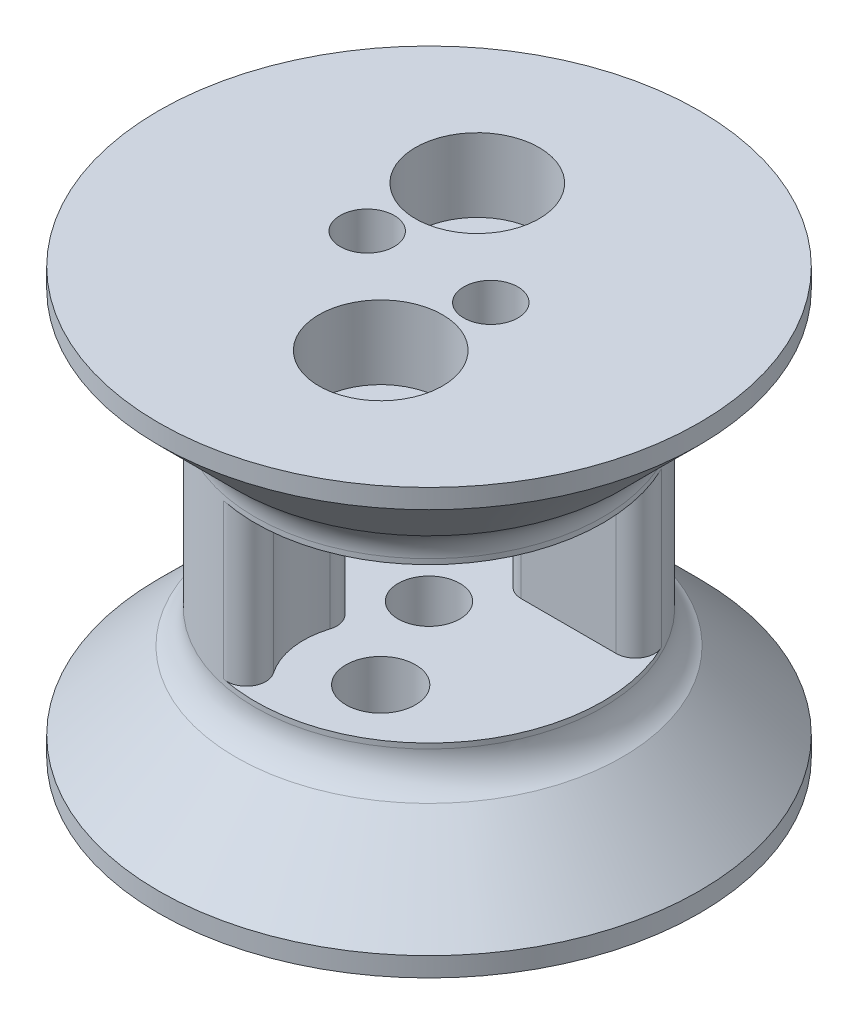
ISO-10303-21;
HEADER;
FILE_DESCRIPTION(('STEP AP214'),'2;1');
FILE_NAME('part.step','',(''),(''),'','','');
FILE_SCHEMA(('AUTOMOTIVE_DESIGN { 1 0 10303 214 1 1 1 1 }'));
ENDSEC;
DATA;
#1=APPLICATION_CONTEXT('core data for automotive mechanical design processes');
#2=APPLICATION_PROTOCOL_DEFINITION('international standard','automotive_design',2000,#1);
#3=PRODUCT_CONTEXT('',#1,'mechanical');
#4=PRODUCT('Part','Part','',(#3));
#5=PRODUCT_RELATED_PRODUCT_CATEGORY('part','',(#4));
#6=PRODUCT_DEFINITION_FORMATION('','',#4);
#7=PRODUCT_DEFINITION_CONTEXT('part definition',#1,'design');
#8=PRODUCT_DEFINITION('design','',#6,#7);
#9=PRODUCT_DEFINITION_SHAPE('','',#8);
#10=(LENGTH_UNIT() NAMED_UNIT(*) SI_UNIT(.MILLI.,.METRE.));
#11=(NAMED_UNIT(*) PLANE_ANGLE_UNIT() SI_UNIT($,.RADIAN.));
#12=(NAMED_UNIT(*) SI_UNIT($,.STERADIAN.) SOLID_ANGLE_UNIT());
#13=UNCERTAINTY_MEASURE_WITH_UNIT(LENGTH_MEASURE(1.E-05),#10,'distance_accuracy_value','');
#14=(GEOMETRIC_REPRESENTATION_CONTEXT(3) GLOBAL_UNCERTAINTY_ASSIGNED_CONTEXT((#13)) GLOBAL_UNIT_ASSIGNED_CONTEXT((#10,
#11,#12)) REPRESENTATION_CONTEXT('',''));
#15=CARTESIAN_POINT('',(0.,0.,0.));
#16=DIRECTION('',(0.,0.,1.));
#17=DIRECTION('',(1.,0.,0.));
#18=AXIS2_PLACEMENT_3D('',#15,#16,#17);
#19=CARTESIAN_POINT('',(3.17499999999952,-13.97,6.34999999999981));
#20=DIRECTION('',(0.,1.,0.));
#21=DIRECTION('',(0.,0.,1.));
#22=AXIS2_PLACEMENT_3D('',#19,#20,#21);
#23=CYLINDRICAL_SURFACE('',#22,2.286);
#24=CARTESIAN_POINT('',(3.17499999999952,5.08,6.34999999999981));
#25=DIRECTION('',(0.,1.,0.));
#26=DIRECTION('',(0.,0.,1.));
#27=AXIS2_PLACEMENT_3D('',#24,#25,#26);
#28=CIRCLE('',#27,2.286);
#29=CARTESIAN_POINT('',(3.17499999999952,5.08,8.63599999999981));
#30=VERTEX_POINT('',#29);
#31=EDGE_CURVE('E359',#30,#30,#28,.T.);
#32=ORIENTED_EDGE('',*,*,#31,.F.);
#33=EDGE_LOOP('',(#32));
#34=FACE_BOUND('',#33,.T.);
#35=CARTESIAN_POINT('',(3.17499999999952,9.144,6.34999999999981));
#36=DIRECTION('',(0.,1.,0.));
#37=DIRECTION('',(0.,0.,1.));
#38=AXIS2_PLACEMENT_3D('',#35,#36,#37);
#39=CIRCLE('',#38,2.286);
#40=CARTESIAN_POINT('',(3.17499999999952,9.144,8.63599999999981));
#41=VERTEX_POINT('',#40);
#42=EDGE_CURVE('E249',#41,#41,#39,.F.);
#43=ORIENTED_EDGE('',*,*,#42,.F.);
#44=EDGE_LOOP('',(#43));
#45=FACE_BOUND('',#44,.T.);
#46=ADVANCED_FACE('F45',(#34,#45),#23,.F.);
#47=CARTESIAN_POINT('',(-3.175,-13.97,-6.35));
#48=DIRECTION('',(0.,1.,0.));
#49=DIRECTION('',(0.,0.,1.));
#50=AXIS2_PLACEMENT_3D('',#47,#48,#49);
#51=CYLINDRICAL_SURFACE('',#50,2.286);
#52=CARTESIAN_POINT('',(-3.175,5.08,-6.35));
#53=DIRECTION('',(0.,1.,0.));
#54=DIRECTION('',(0.,0.,1.));
#55=AXIS2_PLACEMENT_3D('',#52,#53,#54);
#56=CIRCLE('',#55,2.286);
#57=CARTESIAN_POINT('',(-3.175,5.08,-4.064));
#58=VERTEX_POINT('',#57);
#59=EDGE_CURVE('E173',#58,#58,#56,.T.);
#60=ORIENTED_EDGE('',*,*,#59,.F.);
#61=EDGE_LOOP('',(#60));
#62=FACE_BOUND('',#61,.T.);
#63=CARTESIAN_POINT('',(-3.175,9.144,-6.35));
#64=DIRECTION('',(0.,1.,0.));
#65=DIRECTION('',(0.,0.,1.));
#66=AXIS2_PLACEMENT_3D('',#63,#64,#65);
#67=CIRCLE('',#66,2.286);
#68=CARTESIAN_POINT('',(-3.175,9.144,-4.064));
#69=VERTEX_POINT('',#68);
#70=EDGE_CURVE('E245',#69,#69,#67,.F.);
#71=ORIENTED_EDGE('',*,*,#70,.F.);
#72=EDGE_LOOP('',(#71));
#73=FACE_BOUND('',#72,.T.);
#74=ADVANCED_FACE('F320',(#62,#73),#51,.F.);
#75=CARTESIAN_POINT('',(0.,13.97,0.));
#76=DIRECTION('',(0.,-1.,0.));
#77=DIRECTION('',(0.,0.,-1.));
#78=AXIS2_PLACEMENT_3D('',#75,#76,#77);
#79=CYLINDRICAL_SURFACE('',#78,11.43);
#80=CARTESIAN_POINT('',(0.,5.42029547438754,0.));
#81=DIRECTION('',(0.,1.,0.));
#82=DIRECTION('',(0.,0.,1.));
#83=AXIS2_PLACEMENT_3D('',#80,#81,#82);
#84=CIRCLE('',#83,11.43);
#85=CARTESIAN_POINT('',(0.,5.42029547438754,11.43));
#86=VERTEX_POINT('',#85);
#87=EDGE_CURVE('E11',#86,#86,#84,.F.);
#88=ORIENTED_EDGE('',*,*,#87,.T.);
#89=EDGE_LOOP('',(#88));
#90=FACE_BOUND('',#89,.T.);
#91=CARTESIAN_POINT('',(0.,-5.42029547438753,0.));
#92=DIRECTION('',(0.,-1.,0.));
#93=DIRECTION('',(0.,0.,-1.));
#94=AXIS2_PLACEMENT_3D('',#91,#92,#93);
#95=CIRCLE('',#94,11.43);
#96=CARTESIAN_POINT('',(0.,-5.42029547438753,-11.43));
#97=VERTEX_POINT('',#96);
#98=EDGE_CURVE('E55',#97,#97,#95,.F.);
#99=ORIENTED_EDGE('',*,*,#98,.T.);
#100=EDGE_LOOP('',(#99));
#101=FACE_BOUND('',#100,.T.);
#102=CARTESIAN_POINT('',(0.,5.08,0.));
#103=DIRECTION('',(0.,1.,0.));
#104=DIRECTION('',(0.,0.,1.));
#105=AXIS2_PLACEMENT_3D('',#102,#103,#104);
#106=CIRCLE('',#105,11.43);
#107=CARTESIAN_POINT('',(2.31307511856047,5.08,-11.1935063092802));
#108=VERTEX_POINT('',#107);
#109=CARTESIAN_POINT('',(-10.2780664334005,5.08,5.00062499999811));
#110=VERTEX_POINT('',#109);
#111=EDGE_CURVE('E373',#108,#110,#106,.T.);
#112=ORIENTED_EDGE('',*,*,#111,.T.);
#113=DIRECTION('',(0.,-1.,0.));
#114=VECTOR('',#113,1.);
#115=CARTESIAN_POINT('',(-10.2780664334005,13.97,5.00062499999811));
#116=LINE('',#115,#114);
#117=CARTESIAN_POINT('',(-10.2780664334005,-5.08,5.00062499999811));
#118=VERTEX_POINT('',#117);
#119=EDGE_CURVE('E187',#110,#118,#116,.T.);
#120=ORIENTED_EDGE('',*,*,#119,.T.);
#121=CARTESIAN_POINT('',(0.,-5.08,0.));
#122=DIRECTION('',(0.,1.,0.));
#123=DIRECTION('',(0.,0.,1.));
#124=AXIS2_PLACEMENT_3D('',#121,#122,#123);
#125=CIRCLE('',#124,11.43);
#126=CARTESIAN_POINT('',(2.31307511856047,-5.08,-11.1935063092802));
#127=VERTEX_POINT('',#126);
#128=EDGE_CURVE('E163',#127,#118,#125,.T.);
#129=ORIENTED_EDGE('',*,*,#128,.F.);
#130=DIRECTION('',(0.,-1.,0.));
#131=VECTOR('',#130,1.);
#132=CARTESIAN_POINT('',(2.31307511856047,13.97,-11.1935063092802));
#133=LINE('',#132,#131);
#134=EDGE_CURVE('E179',#127,#108,#133,.F.);
#135=ORIENTED_EDGE('',*,*,#134,.T.);
#136=EDGE_LOOP('',(#112,#120,#129,#135));
#137=FACE_BOUND('',#136,.T.);
#138=CARTESIAN_POINT('',(-2.31307511856093,5.08,11.1935063092801));
#139=VERTEX_POINT('',#138);
#140=CARTESIAN_POINT('',(10.2780664333996,5.08,-5.000625));
#141=VERTEX_POINT('',#140);
#142=EDGE_CURVE('E386',#139,#141,#106,.T.);
#143=ORIENTED_EDGE('',*,*,#142,.T.);
#144=DIRECTION('',(0.,-1.,0.));
#145=VECTOR('',#144,1.);
#146=CARTESIAN_POINT('',(10.2780664333996,13.97,-5.000625));
#147=LINE('',#146,#145);
#148=CARTESIAN_POINT('',(10.2780664333996,-5.08,-5.000625));
#149=VERTEX_POINT('',#148);
#150=EDGE_CURVE('E183',#141,#149,#147,.T.);
#151=ORIENTED_EDGE('',*,*,#150,.T.);
#152=CARTESIAN_POINT('',(-2.31307511856093,-5.08,11.1935063092801));
#153=VERTEX_POINT('',#152);
#154=EDGE_CURVE('E171',#153,#149,#125,.T.);
#155=ORIENTED_EDGE('',*,*,#154,.F.);
#156=DIRECTION('',(0.,-1.,0.));
#157=VECTOR('',#156,1.);
#158=CARTESIAN_POINT('',(-2.31307511856093,13.97,11.1935063092801));
#159=LINE('',#158,#157);
#160=EDGE_CURVE('E167',#153,#139,#159,.F.);
#161=ORIENTED_EDGE('',*,*,#160,.T.);
#162=EDGE_LOOP('',(#143,#151,#155,#161));
#163=FACE_BOUND('',#162,.T.);
#164=ADVANCED_FACE('F292',(#90,#101,#137,#163),#79,.T.);
#165=CARTESIAN_POINT('',(0.,13.97,0.));
#166=DIRECTION('',(0.,1.,0.));
#167=DIRECTION('',(0.,0.,1.));
#168=AXIS2_PLACEMENT_3D('',#165,#166,#167);
#169=PLANE('',#168);
#170=CARTESIAN_POINT('',(-4.064,13.97,0.));
#171=DIRECTION('',(0.,1.,0.));
#172=DIRECTION('',(0.,0.,1.));
#173=AXIS2_PLACEMENT_3D('',#170,#171,#172);
#174=CIRCLE('',#173,1.778);
#175=CARTESIAN_POINT('',(-4.064,13.97,1.778));
#176=VERTEX_POINT('',#175);
#177=EDGE_CURVE('E268',#176,#176,#174,.T.);
#178=ORIENTED_EDGE('',*,*,#177,.F.);
#179=EDGE_LOOP('',(#178));
#180=FACE_BOUND('',#179,.T.);
#181=CARTESIAN_POINT('',(4.064,13.97,0.));
#182=DIRECTION('',(0.,1.,0.));
#183=DIRECTION('',(0.,0.,-1.));
#184=AXIS2_PLACEMENT_3D('',#181,#182,#183);
#185=CIRCLE('',#184,1.778);
#186=CARTESIAN_POINT('',(4.064,13.97,-1.778));
#187=VERTEX_POINT('',#186);
#188=EDGE_CURVE('E515',#187,#187,#185,.T.);
#189=ORIENTED_EDGE('',*,*,#188,.F.);
#190=EDGE_LOOP('',(#189));
#191=FACE_BOUND('',#190,.T.);
#192=CARTESIAN_POINT('',(-3.175,13.97,-6.35));
#193=DIRECTION('',(0.,1.,0.));
#194=DIRECTION('',(0.,0.,1.));
#195=AXIS2_PLACEMENT_3D('',#192,#193,#194);
#196=CIRCLE('',#195,4.064);
#197=CARTESIAN_POINT('',(-3.175,13.97,-10.414));
#198=VERTEX_POINT('',#197);
#199=EDGE_CURVE('E258',#198,#198,#196,.F.);
#200=ORIENTED_EDGE('',*,*,#199,.T.);
#201=EDGE_LOOP('',(#200));
#202=FACE_BOUND('',#201,.T.);
#203=CARTESIAN_POINT('',(3.17499999999952,13.97,6.34999999999981));
#204=DIRECTION('',(0.,1.,0.));
#205=DIRECTION('',(0.,0.,1.));
#206=AXIS2_PLACEMENT_3D('',#203,#204,#205);
#207=CIRCLE('',#206,4.064);
#208=CARTESIAN_POINT('',(3.17499999999952,13.97,2.28599999999981));
#209=VERTEX_POINT('',#208);
#210=EDGE_CURVE('E254',#209,#209,#207,.F.);
#211=ORIENTED_EDGE('',*,*,#210,.T.);
#212=EDGE_LOOP('',(#211));
#213=FACE_BOUND('',#212,.T.);
#214=CARTESIAN_POINT('',(0.,13.97,0.));
#215=DIRECTION('',(0.,1.,0.));
#216=DIRECTION('',(0.,0.,1.));
#217=AXIS2_PLACEMENT_3D('',#214,#215,#216);
#218=CIRCLE('',#217,17.78);
#219=CARTESIAN_POINT('',(0.,13.97,17.78));
#220=VERTEX_POINT('',#219);
#221=EDGE_CURVE('E354',#220,#220,#218,.T.);
#222=ORIENTED_EDGE('',*,*,#221,.T.);
#223=EDGE_LOOP('',(#222));
#224=FACE_BOUND('',#223,.T.);
#225=ADVANCED_FACE('F449',(#180,#191,#202,#213,#224),#169,.T.);
#226=CARTESIAN_POINT('',(0.,-13.97,0.));
#227=DIRECTION('',(0.,1.,0.));
#228=DIRECTION('',(0.,0.,1.));
#229=AXIS2_PLACEMENT_3D('',#226,#227,#228);
#230=PLANE('',#229);
#231=CARTESIAN_POINT('',(0.,-13.97,0.));
#232=DIRECTION('',(0.,-1.,0.));
#233=DIRECTION('',(0.,0.,-1.));
#234=AXIS2_PLACEMENT_3D('',#231,#232,#233);
#235=CIRCLE('',#234,2.032);
#236=CARTESIAN_POINT('',(0.,-13.97,-2.032));
#237=VERTEX_POINT('',#236);
#238=EDGE_CURVE('E511',#237,#237,#235,.T.);
#239=ORIENTED_EDGE('',*,*,#238,.F.);
#240=EDGE_LOOP('',(#239));
#241=FACE_BOUND('',#240,.T.);
#242=CARTESIAN_POINT('',(-3.175,-13.97,-6.35));
#243=DIRECTION('',(0.,1.,0.));
#244=DIRECTION('',(0.,0.,1.));
#245=AXIS2_PLACEMENT_3D('',#242,#243,#244);
#246=CIRCLE('',#245,2.286);
#247=CARTESIAN_POINT('',(-3.175,-13.97,-4.064));
#248=VERTEX_POINT('',#247);
#249=EDGE_CURVE('E353',#248,#248,#246,.T.);
#250=ORIENTED_EDGE('',*,*,#249,.T.);
#251=EDGE_LOOP('',(#250));
#252=FACE_BOUND('',#251,.T.);
#253=CARTESIAN_POINT('',(3.17499999999952,-13.97,6.34999999999981));
#254=DIRECTION('',(0.,1.,0.));
#255=DIRECTION('',(0.,0.,1.));
#256=AXIS2_PLACEMENT_3D('',#253,#254,#255);
#257=CIRCLE('',#256,2.286);
#258=CARTESIAN_POINT('',(3.17499999999952,-13.97,8.63599999999981));
#259=VERTEX_POINT('',#258);
#260=EDGE_CURVE('E350',#259,#259,#257,.T.);
#261=ORIENTED_EDGE('',*,*,#260,.T.);
#262=EDGE_LOOP('',(#261));
#263=FACE_BOUND('',#262,.T.);
#264=CARTESIAN_POINT('',(0.,-13.97,0.));
#265=DIRECTION('',(0.,1.,0.));
#266=DIRECTION('',(0.,0.,1.));
#267=AXIS2_PLACEMENT_3D('',#264,#265,#266);
#268=CIRCLE('',#267,17.78);
#269=CARTESIAN_POINT('',(0.,-13.97,17.78));
#270=VERTEX_POINT('',#269);
#271=EDGE_CURVE('E262',#270,#270,#268,.T.);
#272=ORIENTED_EDGE('',*,*,#271,.F.);
#273=EDGE_LOOP('',(#272));
#274=FACE_BOUND('',#273,.T.);
#275=ADVANCED_FACE('F448',(#241,#252,#263,#274),#230,.F.);
#276=CARTESIAN_POINT('',(-3.8553029778657E-13,-5.08,3.17499999999943));
#277=DIRECTION('',(1.21426865444611E-13,0.,-1.));
#278=DIRECTION('',(-1.,0.,-1.21426865444611E-13));
#279=AXIS2_PLACEMENT_3D('',#276,#277,#278);
#280=PLANE('',#279);
#281=DIRECTION('',(-1.,0.,-1.21426865444611E-13));
#282=VECTOR('',#281,1.);
#283=CARTESIAN_POINT('',(-3.8553029778657E-13,-5.08,3.17499999999943));
#284=LINE('',#283,#282);
#285=CARTESIAN_POINT('',(-2.8825139289977,-5.08,3.17499999999908));
#286=VERTEX_POINT('',#285);
#287=CARTESIAN_POINT('',(-9.13605905191139,-5.08,3.17499999999832));
#288=VERTEX_POINT('',#287);
#289=EDGE_CURVE('E369',#286,#288,#284,.T.);
#290=ORIENTED_EDGE('',*,*,#289,.T.);
#291=DIRECTION('',(0.,1.,0.));
#292=VECTOR('',#291,1.);
#293=CARTESIAN_POINT('',(-9.13605905191139,5.08,3.17499999999832));
#294=LINE('',#293,#292);
#295=CARTESIAN_POINT('',(-9.13605905191139,5.08,3.17499999999832));
#296=VERTEX_POINT('',#295);
#297=EDGE_CURVE('E157',#288,#296,#294,.T.);
#298=ORIENTED_EDGE('',*,*,#297,.T.);
#299=DIRECTION('',(-1.,0.,-1.21426865444611E-13));
#300=VECTOR('',#299,1.);
#301=CARTESIAN_POINT('',(-3.8553029778657E-13,5.08,3.17499999999943));
#302=LINE('',#301,#300);
#303=CARTESIAN_POINT('',(-2.8825139289977,5.08,3.17499999999908));
#304=VERTEX_POINT('',#303);
#305=EDGE_CURVE('E142',#304,#296,#302,.T.);
#306=ORIENTED_EDGE('',*,*,#305,.F.);
#307=DIRECTION('',(0.,-1.,0.));
#308=VECTOR('',#307,1.);
#309=CARTESIAN_POINT('',(-2.8825139289977,-5.08,3.17499999999908));
#310=LINE('',#309,#308);
#311=EDGE_CURVE('E155',#304,#286,#310,.T.);
#312=ORIENTED_EDGE('',*,*,#311,.T.);
#313=EDGE_LOOP('',(#290,#298,#306,#312));
#314=FACE_BOUND('',#313,.T.);
#315=ADVANCED_FACE('F154',(#314),#280,.T.);
#316=CARTESIAN_POINT('',(-3.175,-5.08,-6.35));
#317=DIRECTION('',(0.,1.,0.));
#318=DIRECTION('',(0.,0.,1.));
#319=AXIS2_PLACEMENT_3D('',#316,#317,#318);
#320=CYLINDRICAL_SURFACE('',#319,5.08);
#321=CARTESIAN_POINT('',(-3.175,5.08,-6.35));
#322=DIRECTION('',(0.,1.,0.));
#323=DIRECTION('',(0.,0.,1.));
#324=AXIS2_PLACEMENT_3D('',#321,#322,#323);
#325=CIRCLE('',#324,5.08);
#326=CARTESIAN_POINT('',(1.67101114319808,5.08,-4.826));
#327=VERTEX_POINT('',#326);
#328=CARTESIAN_POINT('',(1.009853417643,5.08,-9.2298267088215));
#329=VERTEX_POINT('',#328);
#330=EDGE_CURVE('E393',#327,#329,#325,.T.);
#331=ORIENTED_EDGE('',*,*,#330,.T.);
#332=DIRECTION('',(0.,1.,0.));
#333=VECTOR('',#332,1.);
#334=CARTESIAN_POINT('',(1.009853417643,-5.08,-9.2298267088215));
#335=LINE('',#334,#333);
#336=CARTESIAN_POINT('',(1.009853417643,-5.08,-9.2298267088215));
#337=VERTEX_POINT('',#336);
#338=EDGE_CURVE('E202',#329,#337,#335,.F.);
#339=ORIENTED_EDGE('',*,*,#338,.T.);
#340=CARTESIAN_POINT('',(-3.175,-5.08,-6.35));
#341=DIRECTION('',(0.,1.,0.));
#342=DIRECTION('',(0.,0.,1.));
#343=AXIS2_PLACEMENT_3D('',#340,#341,#342);
#344=CIRCLE('',#343,5.08);
#345=CARTESIAN_POINT('',(1.67101114319808,-5.08,-4.826));
#346=VERTEX_POINT('',#345);
#347=EDGE_CURVE('E169',#346,#337,#344,.T.);
#348=ORIENTED_EDGE('',*,*,#347,.F.);
#349=DIRECTION('',(0.,1.,0.));
#350=VECTOR('',#349,1.);
#351=CARTESIAN_POINT('',(1.67101114319808,-5.08,-4.826));
#352=LINE('',#351,#350);
#353=EDGE_CURVE('E198',#346,#327,#352,.T.);
#354=ORIENTED_EDGE('',*,*,#353,.T.);
#355=EDGE_LOOP('',(#331,#339,#348,#354));
#356=FACE_BOUND('',#355,.T.);
#357=ADVANCED_FACE('F415',(#356),#320,.F.);
#358=CARTESIAN_POINT('',(0.,-5.08,-3.175));
#359=DIRECTION('',(0.,0.,1.));
#360=DIRECTION('',(1.,0.,0.));
#361=AXIS2_PLACEMENT_3D('',#358,#359,#360);
#362=PLANE('',#361);
#363=DIRECTION('',(1.,0.,0.));
#364=VECTOR('',#363,1.);
#365=CARTESIAN_POINT('',(0.,-5.08,-3.175));
#366=LINE('',#365,#364);
#367=CARTESIAN_POINT('',(2.8825139289976,-5.08,-3.175));
#368=VERTEX_POINT('',#367);
#369=CARTESIAN_POINT('',(9.13605905191073,-5.08,-3.175));
#370=VERTEX_POINT('',#369);
#371=EDGE_CURVE('E377',#368,#370,#366,.T.);
#372=ORIENTED_EDGE('',*,*,#371,.T.);
#373=DIRECTION('',(0.,1.,0.));
#374=VECTOR('',#373,1.);
#375=CARTESIAN_POINT('',(9.13605905191073,5.08,-3.175));
#376=LINE('',#375,#374);
#377=CARTESIAN_POINT('',(9.13605905191073,5.08,-3.175));
#378=VERTEX_POINT('',#377);
#379=EDGE_CURVE('E194',#370,#378,#376,.T.);
#380=ORIENTED_EDGE('',*,*,#379,.T.);
#381=DIRECTION('',(1.,0.,0.));
#382=VECTOR('',#381,1.);
#383=CARTESIAN_POINT('',(0.,5.08,-3.175));
#384=LINE('',#383,#382);
#385=CARTESIAN_POINT('',(2.8825139289976,5.08,-3.175));
#386=VERTEX_POINT('',#385);
#387=EDGE_CURVE('E389',#386,#378,#384,.T.);
#388=ORIENTED_EDGE('',*,*,#387,.F.);
#389=DIRECTION('',(0.,-1.,0.));
#390=VECTOR('',#389,1.);
#391=CARTESIAN_POINT('',(2.8825139289976,-5.08,-3.175));
#392=LINE('',#391,#390);
#393=EDGE_CURVE('E191',#386,#368,#392,.T.);
#394=ORIENTED_EDGE('',*,*,#393,.T.);
#395=EDGE_LOOP('',(#372,#380,#388,#394));
#396=FACE_BOUND('',#395,.T.);
#397=ADVANCED_FACE('F423',(#396),#362,.T.);
#398=CARTESIAN_POINT('',(3.17499999999952,-5.08,6.34999999999981));
#399=DIRECTION('',(0.,1.,0.));
#400=DIRECTION('',(0.,0.,1.));
#401=AXIS2_PLACEMENT_3D('',#398,#399,#400);
#402=CYLINDRICAL_SURFACE('',#401,5.08);
#403=CARTESIAN_POINT('',(3.17499999999952,5.08,6.34999999999981));
#404=DIRECTION('',(0.,1.,0.));
#405=DIRECTION('',(0.,0.,1.));
#406=AXIS2_PLACEMENT_3D('',#403,#404,#405);
#407=CIRCLE('',#406,5.08);
#408=CARTESIAN_POINT('',(-1.67101114319838,5.08,4.82599999999923));
#409=VERTEX_POINT('',#408);
#410=CARTESIAN_POINT('',(-1.00985341764343,5.08,9.2298267088214));
#411=VERTEX_POINT('',#410);
#412=EDGE_CURVE('E143',#409,#411,#407,.T.);
#413=ORIENTED_EDGE('',*,*,#412,.T.);
#414=DIRECTION('',(0.,1.,0.));
#415=VECTOR('',#414,1.);
#416=CARTESIAN_POINT('',(-1.00985341764343,-5.08,9.2298267088214));
#417=LINE('',#416,#415);
#418=CARTESIAN_POINT('',(-1.00985341764343,-5.08,9.2298267088214));
#419=VERTEX_POINT('',#418);
#420=EDGE_CURVE('E62',#411,#419,#417,.F.);
#421=ORIENTED_EDGE('',*,*,#420,.T.);
#422=CARTESIAN_POINT('',(3.17499999999952,-5.08,6.34999999999981));
#423=DIRECTION('',(0.,1.,0.));
#424=DIRECTION('',(0.,0.,1.));
#425=AXIS2_PLACEMENT_3D('',#422,#423,#424);
#426=CIRCLE('',#425,5.08);
#427=CARTESIAN_POINT('',(-1.67101114319838,-5.08,4.82599999999923));
#428=VERTEX_POINT('',#427);
#429=EDGE_CURVE('E372',#428,#419,#426,.T.);
#430=ORIENTED_EDGE('',*,*,#429,.F.);
#431=DIRECTION('',(0.,1.,0.));
#432=VECTOR('',#431,1.);
#433=CARTESIAN_POINT('',(-1.67101114319838,-5.08,4.82599999999923));
#434=LINE('',#433,#432);
#435=EDGE_CURVE('E205',#428,#409,#434,.T.);
#436=ORIENTED_EDGE('',*,*,#435,.T.);
#437=EDGE_LOOP('',(#413,#421,#430,#436));
#438=FACE_BOUND('',#437,.T.);
#439=ADVANCED_FACE('F435',(#438),#402,.F.);
#440=CARTESIAN_POINT('',(0.,-5.08,0.));
#441=DIRECTION('',(0.,1.,0.));
#442=DIRECTION('',(0.,0.,1.));
#443=AXIS2_PLACEMENT_3D('',#440,#441,#442);
#444=PLANE('',#443);
#445=CARTESIAN_POINT('',(0.,-5.08,0.));
#446=DIRECTION('',(0.,1.,0.));
#447=DIRECTION('',(0.,0.,1.));
#448=AXIS2_PLACEMENT_3D('',#445,#446,#447);
#449=CIRCLE('',#448,2.032);
#450=CARTESIAN_POINT('',(0.,-5.08,2.032));
#451=VERTEX_POINT('',#450);
#452=EDGE_CURVE('E49',#451,#451,#449,.T.);
#453=ORIENTED_EDGE('',*,*,#452,.F.);
#454=EDGE_LOOP('',(#453));
#455=FACE_BOUND('',#454,.T.);
#456=CARTESIAN_POINT('',(-3.175,-5.08,-6.35));
#457=DIRECTION('',(0.,1.,0.));
#458=DIRECTION('',(0.,0.,1.));
#459=AXIS2_PLACEMENT_3D('',#456,#457,#458);
#460=CIRCLE('',#459,2.286);
#461=CARTESIAN_POINT('',(-3.175,-5.08,-4.064));
#462=VERTEX_POINT('',#461);
#463=EDGE_CURVE('E159',#462,#462,#460,.T.);
#464=ORIENTED_EDGE('',*,*,#463,.F.);
#465=EDGE_LOOP('',(#464));
#466=FACE_BOUND('',#465,.T.);
#467=CARTESIAN_POINT('',(3.17499999999952,-5.08,6.34999999999981));
#468=DIRECTION('',(0.,1.,0.));
#469=DIRECTION('',(0.,0.,1.));
#470=AXIS2_PLACEMENT_3D('',#467,#468,#469);
#471=CIRCLE('',#470,2.286);
#472=CARTESIAN_POINT('',(3.17499999999952,-5.08,8.63599999999981));
#473=VERTEX_POINT('',#472);
#474=EDGE_CURVE('E347',#473,#473,#471,.T.);
#475=ORIENTED_EDGE('',*,*,#474,.F.);
#476=EDGE_LOOP('',(#475));
#477=FACE_BOUND('',#476,.T.);
#478=ORIENTED_EDGE('',*,*,#289,.F.);
#479=CARTESIAN_POINT('',(-2.88251392899785,-5.08,4.44499999999908));
#480=DIRECTION('',(0.,1.,0.));
#481=DIRECTION('',(0.,0.,1.));
#482=AXIS2_PLACEMENT_3D('',#479,#480,#481);
#483=CIRCLE('',#482,1.27);
#484=EDGE_CURVE('E69',#286,#428,#483,.F.);
#485=ORIENTED_EDGE('',*,*,#484,.T.);
#486=ORIENTED_EDGE('',*,*,#429,.T.);
#487=CARTESIAN_POINT('',(-2.05606677205416,-5.08,9.94978338602679));
#488=DIRECTION('',(0.,1.,0.));
#489=DIRECTION('',(0.,0.,1.));
#490=AXIS2_PLACEMENT_3D('',#487,#488,#489);
#491=CIRCLE('',#490,1.27);
#492=EDGE_CURVE('E149',#419,#153,#491,.F.);
#493=ORIENTED_EDGE('',*,*,#492,.T.);
#494=ORIENTED_EDGE('',*,*,#154,.T.);
#495=CARTESIAN_POINT('',(9.13605905191073,-5.08,-4.445));
#496=DIRECTION('',(0.,1.,0.));
#497=DIRECTION('',(0.,0.,1.));
#498=AXIS2_PLACEMENT_3D('',#495,#496,#497);
#499=CIRCLE('',#498,1.27);
#500=EDGE_CURVE('E220',#149,#370,#499,.F.);
#501=ORIENTED_EDGE('',*,*,#500,.T.);
#502=ORIENTED_EDGE('',*,*,#371,.F.);
#503=CARTESIAN_POINT('',(2.8825139289976,-5.08,-4.445));
#504=DIRECTION('',(0.,1.,0.));
#505=DIRECTION('',(0.,0.,1.));
#506=AXIS2_PLACEMENT_3D('',#503,#504,#505);
#507=CIRCLE('',#506,1.27);
#508=EDGE_CURVE('E241',#368,#346,#507,.F.);
#509=ORIENTED_EDGE('',*,*,#508,.T.);
#510=ORIENTED_EDGE('',*,*,#347,.T.);
#511=CARTESIAN_POINT('',(2.05606677205375,-5.08,-9.94978338602687));
#512=DIRECTION('',(0.,1.,0.));
#513=DIRECTION('',(0.,0.,1.));
#514=AXIS2_PLACEMENT_3D('',#511,#512,#513);
#515=CIRCLE('',#514,1.27);
#516=EDGE_CURVE('E226',#337,#127,#515,.F.);
#517=ORIENTED_EDGE('',*,*,#516,.T.);
#518=ORIENTED_EDGE('',*,*,#128,.T.);
#519=CARTESIAN_POINT('',(-9.13605905191155,-5.08,4.44499999999832));
#520=DIRECTION('',(0.,1.,0.));
#521=DIRECTION('',(0.,0.,1.));
#522=AXIS2_PLACEMENT_3D('',#519,#520,#521);
#523=CIRCLE('',#522,1.27);
#524=EDGE_CURVE('E213',#118,#288,#523,.F.);
#525=ORIENTED_EDGE('',*,*,#524,.T.);
#526=EDGE_LOOP('',(#478,#485,#486,#493,#494,#501,#502,#509,#510,#517,#518,#525));
#527=FACE_BOUND('',#526,.T.);
#528=ADVANCED_FACE('F341',(#455,#466,#477,#527),#444,.T.);
#529=CARTESIAN_POINT('',(0.,5.08,0.));
#530=DIRECTION('',(0.,1.,0.));
#531=DIRECTION('',(0.,0.,1.));
#532=AXIS2_PLACEMENT_3D('',#529,#530,#531);
#533=PLANE('',#532);
#534=CARTESIAN_POINT('',(-4.064,5.08,0.));
#535=DIRECTION('',(0.,1.,0.));
#536=DIRECTION('',(0.,0.,1.));
#537=AXIS2_PLACEMENT_3D('',#534,#535,#536);
#538=CIRCLE('',#537,1.778);
#539=CARTESIAN_POINT('',(-4.064,5.08,1.778));
#540=VERTEX_POINT('',#539);
#541=EDGE_CURVE('E267',#540,#540,#538,.F.);
#542=ORIENTED_EDGE('',*,*,#541,.F.);
#543=EDGE_LOOP('',(#542));
#544=FACE_BOUND('',#543,.T.);
#545=CARTESIAN_POINT('',(4.064,5.08,0.));
#546=DIRECTION('',(0.,1.,0.));
#547=DIRECTION('',(0.,0.,1.));
#548=AXIS2_PLACEMENT_3D('',#545,#546,#547);
#549=CIRCLE('',#548,1.778);
#550=CARTESIAN_POINT('',(4.064,5.08,1.778));
#551=VERTEX_POINT('',#550);
#552=EDGE_CURVE('E263',#551,#551,#549,.F.);
#553=ORIENTED_EDGE('',*,*,#552,.F.);
#554=EDGE_LOOP('',(#553));
#555=FACE_BOUND('',#554,.T.);
#556=ORIENTED_EDGE('',*,*,#59,.T.);
#557=EDGE_LOOP('',(#556));
#558=FACE_BOUND('',#557,.T.);
#559=ORIENTED_EDGE('',*,*,#31,.T.);
#560=EDGE_LOOP('',(#559));
#561=FACE_BOUND('',#560,.T.);
#562=ORIENTED_EDGE('',*,*,#412,.F.);
#563=CARTESIAN_POINT('',(-2.88251392899785,5.08,4.44499999999908));
#564=DIRECTION('',(0.,1.,0.));
#565=DIRECTION('',(0.,0.,1.));
#566=AXIS2_PLACEMENT_3D('',#563,#564,#565);
#567=CIRCLE('',#566,1.27);
#568=EDGE_CURVE('E138',#409,#304,#567,.T.);
#569=ORIENTED_EDGE('',*,*,#568,.T.);
#570=ORIENTED_EDGE('',*,*,#305,.T.);
#571=CARTESIAN_POINT('',(-9.13605905191155,5.08,4.44499999999832));
#572=DIRECTION('',(0.,1.,0.));
#573=DIRECTION('',(0.,0.,1.));
#574=AXIS2_PLACEMENT_3D('',#571,#572,#573);
#575=CIRCLE('',#574,1.27);
#576=EDGE_CURVE('E210',#296,#110,#575,.T.);
#577=ORIENTED_EDGE('',*,*,#576,.T.);
#578=ORIENTED_EDGE('',*,*,#111,.F.);
#579=CARTESIAN_POINT('',(2.05606677205375,5.08,-9.94978338602687));
#580=DIRECTION('',(0.,1.,0.));
#581=DIRECTION('',(0.,0.,1.));
#582=AXIS2_PLACEMENT_3D('',#579,#580,#581);
#583=CIRCLE('',#582,1.27);
#584=EDGE_CURVE('E223',#108,#329,#583,.T.);
#585=ORIENTED_EDGE('',*,*,#584,.T.);
#586=ORIENTED_EDGE('',*,*,#330,.F.);
#587=CARTESIAN_POINT('',(2.8825139289976,5.08,-4.445));
#588=DIRECTION('',(0.,1.,0.));
#589=DIRECTION('',(0.,0.,1.));
#590=AXIS2_PLACEMENT_3D('',#587,#588,#589);
#591=CIRCLE('',#590,1.27);
#592=EDGE_CURVE('E238',#327,#386,#591,.T.);
#593=ORIENTED_EDGE('',*,*,#592,.T.);
#594=ORIENTED_EDGE('',*,*,#387,.T.);
#595=CARTESIAN_POINT('',(9.13605905191073,5.08,-4.445));
#596=DIRECTION('',(0.,1.,0.));
#597=DIRECTION('',(0.,0.,1.));
#598=AXIS2_PLACEMENT_3D('',#595,#596,#597);
#599=CIRCLE('',#598,1.27);
#600=EDGE_CURVE('E216',#378,#141,#599,.T.);
#601=ORIENTED_EDGE('',*,*,#600,.T.);
#602=ORIENTED_EDGE('',*,*,#142,.F.);
#603=CARTESIAN_POINT('',(-2.05606677205416,5.08,9.94978338602679));
#604=DIRECTION('',(0.,1.,0.));
#605=DIRECTION('',(0.,0.,1.));
#606=AXIS2_PLACEMENT_3D('',#603,#604,#605);
#607=CIRCLE('',#606,1.27);
#608=EDGE_CURVE('E230',#139,#411,#607,.T.);
#609=ORIENTED_EDGE('',*,*,#608,.T.);
#610=EDGE_LOOP('',(#562,#569,#570,#577,#578,#585,#586,#593,#594,#601,#602,#609));
#611=FACE_BOUND('',#610,.T.);
#612=ADVANCED_FACE('F140',(#544,#555,#558,#561,#611),#533,.F.);
#613=ORIENTED_EDGE('',*,*,#474,.T.);
#614=EDGE_LOOP('',(#613));
#615=FACE_BOUND('',#614,.T.);
#616=ORIENTED_EDGE('',*,*,#260,.F.);
#617=EDGE_LOOP('',(#616));
#618=FACE_BOUND('',#617,.T.);
#619=ADVANCED_FACE('F323',(#615,#618),#23,.F.);
#620=ORIENTED_EDGE('',*,*,#463,.T.);
#621=EDGE_LOOP('',(#620));
#622=FACE_BOUND('',#621,.T.);
#623=ORIENTED_EDGE('',*,*,#249,.F.);
#624=EDGE_LOOP('',(#623));
#625=FACE_BOUND('',#624,.T.);
#626=ADVANCED_FACE('F329',(#622,#625),#51,.F.);
#627=CARTESIAN_POINT('',(-9.13605905191155,13.97,4.44499999999832));
#628=DIRECTION('',(0.,-1.,0.));
#629=DIRECTION('',(0.,0.,-1.));
#630=AXIS2_PLACEMENT_3D('',#627,#628,#629);
#631=CYLINDRICAL_SURFACE('',#630,1.27);
#632=ORIENTED_EDGE('',*,*,#524,.F.);
#633=ORIENTED_EDGE('',*,*,#119,.F.);
#634=ORIENTED_EDGE('',*,*,#576,.F.);
#635=ORIENTED_EDGE('',*,*,#297,.F.);
#636=EDGE_LOOP('',(#632,#633,#634,#635));
#637=FACE_BOUND('',#636,.T.);
#638=ADVANCED_FACE('F339',(#637),#631,.T.);
#639=CARTESIAN_POINT('',(9.13605905191073,13.97,-4.445));
#640=DIRECTION('',(0.,-1.,0.));
#641=DIRECTION('',(0.,0.,-1.));
#642=AXIS2_PLACEMENT_3D('',#639,#640,#641);
#643=CYLINDRICAL_SURFACE('',#642,1.27);
#644=ORIENTED_EDGE('',*,*,#500,.F.);
#645=ORIENTED_EDGE('',*,*,#150,.F.);
#646=ORIENTED_EDGE('',*,*,#600,.F.);
#647=ORIENTED_EDGE('',*,*,#379,.F.);
#648=EDGE_LOOP('',(#644,#645,#646,#647));
#649=FACE_BOUND('',#648,.T.);
#650=ADVANCED_FACE('F428',(#649),#643,.T.);
#651=CARTESIAN_POINT('',(2.05606677205375,-5.08,-9.94978338602687));
#652=DIRECTION('',(0.,-1.,0.));
#653=DIRECTION('',(0.,0.,-1.));
#654=AXIS2_PLACEMENT_3D('',#651,#652,#653);
#655=CYLINDRICAL_SURFACE('',#654,1.27);
#656=ORIENTED_EDGE('',*,*,#516,.F.);
#657=ORIENTED_EDGE('',*,*,#338,.F.);
#658=ORIENTED_EDGE('',*,*,#584,.F.);
#659=ORIENTED_EDGE('',*,*,#134,.F.);
#660=EDGE_LOOP('',(#656,#657,#658,#659));
#661=FACE_BOUND('',#660,.T.);
#662=ADVANCED_FACE('F412',(#661),#655,.T.);
#663=CARTESIAN_POINT('',(-2.05606677205416,-5.08,9.94978338602679));
#664=DIRECTION('',(0.,-1.,0.));
#665=DIRECTION('',(0.,0.,-1.));
#666=AXIS2_PLACEMENT_3D('',#663,#664,#665);
#667=CYLINDRICAL_SURFACE('',#666,1.27);
#668=ORIENTED_EDGE('',*,*,#492,.F.);
#669=ORIENTED_EDGE('',*,*,#420,.F.);
#670=ORIENTED_EDGE('',*,*,#608,.F.);
#671=ORIENTED_EDGE('',*,*,#160,.F.);
#672=EDGE_LOOP('',(#668,#669,#670,#671));
#673=FACE_BOUND('',#672,.T.);
#674=ADVANCED_FACE('F434',(#673),#667,.T.);
#675=CARTESIAN_POINT('',(-2.88251392899785,-5.08,4.44499999999908));
#676=DIRECTION('',(0.,1.,0.));
#677=DIRECTION('',(0.,0.,1.));
#678=AXIS2_PLACEMENT_3D('',#675,#676,#677);
#679=CYLINDRICAL_SURFACE('',#678,1.27);
#680=ORIENTED_EDGE('',*,*,#484,.F.);
#681=ORIENTED_EDGE('',*,*,#311,.F.);
#682=ORIENTED_EDGE('',*,*,#568,.F.);
#683=ORIENTED_EDGE('',*,*,#435,.F.);
#684=EDGE_LOOP('',(#680,#681,#682,#683));
#685=FACE_BOUND('',#684,.T.);
#686=ADVANCED_FACE('F161',(#685),#679,.T.);
#687=CARTESIAN_POINT('',(2.8825139289976,-5.08,-4.445));
#688=DIRECTION('',(0.,1.,0.));
#689=DIRECTION('',(0.,0.,1.));
#690=AXIS2_PLACEMENT_3D('',#687,#688,#689);
#691=CYLINDRICAL_SURFACE('',#690,1.27);
#692=ORIENTED_EDGE('',*,*,#508,.F.);
#693=ORIENTED_EDGE('',*,*,#393,.F.);
#694=ORIENTED_EDGE('',*,*,#592,.F.);
#695=ORIENTED_EDGE('',*,*,#353,.F.);
#696=EDGE_LOOP('',(#692,#693,#694,#695));
#697=FACE_BOUND('',#696,.T.);
#698=ADVANCED_FACE('F419',(#697),#691,.T.);
#699=CARTESIAN_POINT('',(0.,7.62,0.));
#700=DIRECTION('',(0.,1.,0.));
#701=DIRECTION('',(0.,0.,1.));
#702=AXIS2_PLACEMENT_3D('',#699,#700,#701);
#703=CYLINDRICAL_SURFACE('',#702,17.78);
#704=CARTESIAN_POINT('',(0.,12.7,0.));
#705=DIRECTION('',(0.,1.,0.));
#706=DIRECTION('',(0.,0.,1.));
#707=AXIS2_PLACEMENT_3D('',#704,#705,#706);
#708=CIRCLE('',#707,17.78);
#709=CARTESIAN_POINT('',(0.,12.7,17.78));
#710=VERTEX_POINT('',#709);
#711=EDGE_CURVE('E280',#710,#710,#708,.T.);
#712=ORIENTED_EDGE('',*,*,#711,.T.);
#713=EDGE_LOOP('',(#712));
#714=FACE_BOUND('',#713,.T.);
#715=ORIENTED_EDGE('',*,*,#221,.F.);
#716=EDGE_LOOP('',(#715));
#717=FACE_BOUND('',#716,.T.);
#718=ADVANCED_FACE('F469',(#714,#717),#703,.T.);
#719=CARTESIAN_POINT('',(0.,-7.62,0.));
#720=DIRECTION('',(0.,-1.,0.));
#721=DIRECTION('',(0.,0.,-1.));
#722=AXIS2_PLACEMENT_3D('',#719,#720,#721);
#723=CYLINDRICAL_SURFACE('',#722,17.78);
#724=CARTESIAN_POINT('',(0.,-12.7,0.));
#725=DIRECTION('',(0.,-1.,0.));
#726=DIRECTION('',(0.,0.,-1.));
#727=AXIS2_PLACEMENT_3D('',#724,#725,#726);
#728=CIRCLE('',#727,17.78);
#729=CARTESIAN_POINT('',(0.,-12.7,-17.78));
#730=VERTEX_POINT('',#729);
#731=EDGE_CURVE('E276',#730,#730,#728,.T.);
#732=ORIENTED_EDGE('',*,*,#731,.T.);
#733=EDGE_LOOP('',(#732));
#734=FACE_BOUND('',#733,.T.);
#735=ORIENTED_EDGE('',*,*,#271,.T.);
#736=EDGE_LOOP('',(#735));
#737=FACE_BOUND('',#736,.T.);
#738=ADVANCED_FACE('F473',(#734,#737),#723,.T.);
#739=CARTESIAN_POINT('',(-3.175,9.144,-6.35));
#740=DIRECTION('',(0.,1.,0.));
#741=DIRECTION('',(0.,0.,1.));
#742=AXIS2_PLACEMENT_3D('',#739,#740,#741);
#743=PLANE('',#742);
#744=CARTESIAN_POINT('',(-3.175,9.144,-6.35));
#745=DIRECTION('',(0.,1.,0.));
#746=DIRECTION('',(0.,0.,1.));
#747=AXIS2_PLACEMENT_3D('',#744,#745,#746);
#748=CIRCLE('',#747,4.064);
#749=CARTESIAN_POINT('',(-3.175,9.144,-10.414));
#750=VERTEX_POINT('',#749);
#751=EDGE_CURVE('E250',#750,#750,#748,.T.);
#752=ORIENTED_EDGE('',*,*,#751,.T.);
#753=EDGE_LOOP('',(#752));
#754=FACE_BOUND('',#753,.T.);
#755=ORIENTED_EDGE('',*,*,#70,.T.);
#756=EDGE_LOOP('',(#755));
#757=FACE_BOUND('',#756,.T.);
#758=ADVANCED_FACE('F479',(#754,#757),#743,.T.);
#759=CARTESIAN_POINT('',(-3.175,13.970012,-6.35));
#760=DIRECTION('',(0.,-1.,0.));
#761=DIRECTION('',(0.,0.,-1.));
#762=AXIS2_PLACEMENT_3D('',#759,#760,#761);
#763=CYLINDRICAL_SURFACE('',#762,4.064);
#764=CARTESIAN_POINT('',(-3.175,13.97,-10.414));
#765=CARTESIAN_POINT('',(-3.175,13.9197291666667,-10.414));
#766=CARTESIAN_POINT('',(-3.175,13.8694583333333,-10.414));
#767=CARTESIAN_POINT('',(-3.175,13.7689166666667,-10.414));
#768=CARTESIAN_POINT('',(-3.175,13.7186458333333,-10.414));
#769=CARTESIAN_POINT('',(-3.175,13.6181041666667,-10.414));
#770=CARTESIAN_POINT('',(-3.175,13.5678333333333,-10.414));
#771=CARTESIAN_POINT('',(-3.175,13.4672916666667,-10.414));
#772=CARTESIAN_POINT('',(-3.175,13.4170208333333,-10.414));
#773=CARTESIAN_POINT('',(-3.175,13.3164791666667,-10.414));
#774=CARTESIAN_POINT('',(-3.175,13.2662083333333,-10.414));
#775=CARTESIAN_POINT('',(-3.175,13.1656666666667,-10.414));
#776=CARTESIAN_POINT('',(-3.175,13.1153958333333,-10.414));
#777=CARTESIAN_POINT('',(-3.175,13.0148541666667,-10.414));
#778=CARTESIAN_POINT('',(-3.175,12.9645833333333,-10.414));
#779=CARTESIAN_POINT('',(-3.175,12.8640416666667,-10.414));
#780=CARTESIAN_POINT('',(-3.175,12.8137708333333,-10.414));
#781=CARTESIAN_POINT('',(-3.175,12.7132291666667,-10.414));
#782=CARTESIAN_POINT('',(-3.175,12.6629583333333,-10.414));
#783=CARTESIAN_POINT('',(-3.175,12.5624166666667,-10.414));
#784=CARTESIAN_POINT('',(-3.175,12.5121458333333,-10.414));
#785=CARTESIAN_POINT('',(-3.175,12.4116041666667,-10.414));
#786=CARTESIAN_POINT('',(-3.175,12.3613333333333,-10.414));
#787=CARTESIAN_POINT('',(-3.175,12.2607916666667,-10.414));
#788=CARTESIAN_POINT('',(-3.175,12.2105208333333,-10.414));
#789=CARTESIAN_POINT('',(-3.175,12.1099791666667,-10.414));
#790=CARTESIAN_POINT('',(-3.175,12.0597083333333,-10.414));
#791=CARTESIAN_POINT('',(-3.175,11.9591666666667,-10.414));
#792=CARTESIAN_POINT('',(-3.175,11.9088958333333,-10.414));
#793=CARTESIAN_POINT('',(-3.175,11.8083541666667,-10.414));
#794=CARTESIAN_POINT('',(-3.175,11.7580833333333,-10.414));
#795=CARTESIAN_POINT('',(-3.175,11.6575416666667,-10.414));
#796=CARTESIAN_POINT('',(-3.175,11.6072708333333,-10.414));
#797=CARTESIAN_POINT('',(-3.175,11.5067291666667,-10.414));
#798=CARTESIAN_POINT('',(-3.175,11.4564583333333,-10.414));
#799=CARTESIAN_POINT('',(-3.175,11.3559166666667,-10.414));
#800=CARTESIAN_POINT('',(-3.175,11.3056458333333,-10.414));
#801=CARTESIAN_POINT('',(-3.175,11.2051041666667,-10.414));
#802=CARTESIAN_POINT('',(-3.175,11.1548333333333,-10.414));
#803=CARTESIAN_POINT('',(-3.175,11.0542916666667,-10.414));
#804=CARTESIAN_POINT('',(-3.175,11.0040208333333,-10.414));
#805=CARTESIAN_POINT('',(-3.175,10.9034791666667,-10.414));
#806=CARTESIAN_POINT('',(-3.175,10.8532083333333,-10.414));
#807=CARTESIAN_POINT('',(-3.175,10.7526666666667,-10.414));
#808=CARTESIAN_POINT('',(-3.175,10.7023958333333,-10.414));
#809=CARTESIAN_POINT('',(-3.175,10.6018541666667,-10.414));
#810=CARTESIAN_POINT('',(-3.175,10.5515833333333,-10.414));
#811=CARTESIAN_POINT('',(-3.175,10.4510416666667,-10.414));
#812=CARTESIAN_POINT('',(-3.175,10.4007708333333,-10.414));
#813=CARTESIAN_POINT('',(-3.175,10.3002291666667,-10.414));
#814=CARTESIAN_POINT('',(-3.175,10.2499583333333,-10.414));
#815=CARTESIAN_POINT('',(-3.175,10.1494166666667,-10.414));
#816=CARTESIAN_POINT('',(-3.175,10.0991458333333,-10.414));
#817=CARTESIAN_POINT('',(-3.175,9.99860416666667,-10.414));
#818=CARTESIAN_POINT('',(-3.175,9.94833333333334,-10.414));
#819=CARTESIAN_POINT('',(-3.175,9.84779166666667,-10.414));
#820=CARTESIAN_POINT('',(-3.175,9.79752083333334,-10.414));
#821=CARTESIAN_POINT('',(-3.175,9.69697916666667,-10.414));
#822=CARTESIAN_POINT('',(-3.175,9.64670833333333,-10.414));
#823=CARTESIAN_POINT('',(-3.175,9.54616666666667,-10.414));
#824=CARTESIAN_POINT('',(-3.175,9.49589583333334,-10.414));
#825=CARTESIAN_POINT('',(-3.175,9.39535416666667,-10.414));
#826=CARTESIAN_POINT('',(-3.175,9.34508333333333,-10.414));
#827=CARTESIAN_POINT('',(-3.175,9.24454166666667,-10.414));
#828=CARTESIAN_POINT('',(-3.175,9.19427083333334,-10.414));
#829=CARTESIAN_POINT('',(-3.175,9.144,-10.414));
#830=B_SPLINE_CURVE_WITH_KNOTS('',3,(#764,#765,#766,#767,#768,#769,#770,#771,#772,#773,#774,
#775,#776,#777,#778,#779,#780,#781,#782,#783,#784,#785,#786,#787,#788,#789,#790,#791,#792,#793,
#794,#795,#796,#797,#798,#799,#800,#801,#802,#803,#804,#805,#806,#807,#808,#809,#810,#811,#812,
#813,#814,#815,#816,#817,#818,#819,#820,#821,#822,#823,#824,#825,#826,#827,#828,#829),
.UNSPECIFIED.,.F.,.F.,(4,2,2,2,2,2,2,2,2,2,2,2,2,2,2,2,2,2,2,2,2,2,2,2,2,2,2,2,2,2,2,2,4),(0.,
0.150812500000002,0.301625000000002,0.452437500000001,0.603250000000001,0.754062500000001,
0.904875000000001,1.0556875,1.2065,1.3573125,1.508125,1.6589375,1.80975,1.9605625,2.111375,
2.2621875,2.413,2.5638125,2.714625,2.8654375,3.01625,3.1670625,3.317875,3.4686875,3.6195,
3.7703125,3.921125,4.0719375,4.22275,4.3735625,4.524375,4.6751875,4.826),.UNSPECIFIED.);
#831=EDGE_CURVE('BSEAM488',#198,#750,#830,.T.);
#832=ORIENTED_EDGE('',*,*,#199,.F.);
#833=ORIENTED_EDGE('',*,*,#751,.F.);
#834=ORIENTED_EDGE('',*,*,#831,.T.);
#835=ORIENTED_EDGE('',*,*,#831,.F.);
#836=EDGE_LOOP('',(#832,#834,#833,#835));
#837=FACE_BOUND('',#836,.T.);
#838=ADVANCED_FACE('F488',(#837),#763,.F.);
#839=CARTESIAN_POINT('',(3.17499999999952,9.144,6.34999999999981));
#840=DIRECTION('',(0.,1.,0.));
#841=DIRECTION('',(0.,0.,1.));
#842=AXIS2_PLACEMENT_3D('',#839,#840,#841);
#843=PLANE('',#842);
#844=CARTESIAN_POINT('',(3.17499999999952,9.144,6.34999999999981));
#845=DIRECTION('',(0.,1.,0.));
#846=DIRECTION('',(0.,0.,1.));
#847=AXIS2_PLACEMENT_3D('',#844,#845,#846);
#848=CIRCLE('',#847,4.064);
#849=CARTESIAN_POINT('',(3.17499999999952,9.144,2.28599999999981));
#850=VERTEX_POINT('',#849);
#851=EDGE_CURVE('E272',#850,#850,#848,.T.);
#852=ORIENTED_EDGE('',*,*,#851,.T.);
#853=EDGE_LOOP('',(#852));
#854=FACE_BOUND('',#853,.T.);
#855=ORIENTED_EDGE('',*,*,#42,.T.);
#856=EDGE_LOOP('',(#855));
#857=FACE_BOUND('',#856,.T.);
#858=ADVANCED_FACE('F484',(#854,#857),#843,.T.);
#859=CARTESIAN_POINT('',(3.17499999999952,13.970012,6.34999999999981));
#860=DIRECTION('',(0.,-1.,0.));
#861=DIRECTION('',(0.,0.,-1.));
#862=AXIS2_PLACEMENT_3D('',#859,#860,#861);
#863=CYLINDRICAL_SURFACE('',#862,4.064);
#864=CARTESIAN_POINT('',(3.17499999999952,13.97,2.28599999999981));
#865=CARTESIAN_POINT('',(3.17499999999952,13.9197291666667,2.28599999999981));
#866=CARTESIAN_POINT('',(3.17499999999952,13.8694583333333,2.28599999999981));
#867=CARTESIAN_POINT('',(3.17499999999952,13.7689166666667,2.28599999999981));
#868=CARTESIAN_POINT('',(3.17499999999952,13.7186458333333,2.28599999999981));
#869=CARTESIAN_POINT('',(3.17499999999952,13.6181041666667,2.28599999999981));
#870=CARTESIAN_POINT('',(3.17499999999952,13.5678333333333,2.28599999999981));
#871=CARTESIAN_POINT('',(3.17499999999952,13.4672916666667,2.28599999999981));
#872=CARTESIAN_POINT('',(3.17499999999952,13.4170208333333,2.28599999999981));
#873=CARTESIAN_POINT('',(3.17499999999952,13.3164791666667,2.28599999999981));
#874=CARTESIAN_POINT('',(3.17499999999952,13.2662083333333,2.28599999999981));
#875=CARTESIAN_POINT('',(3.17499999999952,13.1656666666667,2.28599999999981));
#876=CARTESIAN_POINT('',(3.17499999999952,13.1153958333333,2.28599999999981));
#877=CARTESIAN_POINT('',(3.17499999999952,13.0148541666667,2.28599999999981));
#878=CARTESIAN_POINT('',(3.17499999999952,12.9645833333333,2.28599999999981));
#879=CARTESIAN_POINT('',(3.17499999999952,12.8640416666667,2.28599999999981));
#880=CARTESIAN_POINT('',(3.17499999999952,12.8137708333333,2.28599999999981));
#881=CARTESIAN_POINT('',(3.17499999999952,12.7132291666667,2.28599999999981));
#882=CARTESIAN_POINT('',(3.17499999999952,12.6629583333333,2.28599999999981));
#883=CARTESIAN_POINT('',(3.17499999999952,12.5624166666667,2.28599999999981));
#884=CARTESIAN_POINT('',(3.17499999999952,12.5121458333333,2.28599999999981));
#885=CARTESIAN_POINT('',(3.17499999999952,12.4116041666667,2.28599999999981));
#886=CARTESIAN_POINT('',(3.17499999999952,12.3613333333333,2.28599999999981));
#887=CARTESIAN_POINT('',(3.17499999999952,12.2607916666667,2.28599999999981));
#888=CARTESIAN_POINT('',(3.17499999999952,12.2105208333333,2.28599999999981));
#889=CARTESIAN_POINT('',(3.17499999999952,12.1099791666667,2.28599999999981));
#890=CARTESIAN_POINT('',(3.17499999999952,12.0597083333333,2.28599999999981));
#891=CARTESIAN_POINT('',(3.17499999999952,11.9591666666667,2.28599999999981));
#892=CARTESIAN_POINT('',(3.17499999999952,11.9088958333333,2.28599999999981));
#893=CARTESIAN_POINT('',(3.17499999999952,11.8083541666667,2.28599999999981));
#894=CARTESIAN_POINT('',(3.17499999999952,11.7580833333333,2.28599999999981));
#895=CARTESIAN_POINT('',(3.17499999999952,11.6575416666667,2.28599999999981));
#896=CARTESIAN_POINT('',(3.17499999999952,11.6072708333333,2.28599999999981));
#897=CARTESIAN_POINT('',(3.17499999999952,11.5067291666667,2.28599999999981));
#898=CARTESIAN_POINT('',(3.17499999999952,11.4564583333333,2.28599999999981));
#899=CARTESIAN_POINT('',(3.17499999999952,11.3559166666667,2.28599999999981));
#900=CARTESIAN_POINT('',(3.17499999999952,11.3056458333333,2.28599999999981));
#901=CARTESIAN_POINT('',(3.17499999999952,11.2051041666667,2.28599999999981));
#902=CARTESIAN_POINT('',(3.17499999999952,11.1548333333333,2.28599999999981));
#903=CARTESIAN_POINT('',(3.17499999999952,11.0542916666667,2.28599999999981));
#904=CARTESIAN_POINT('',(3.17499999999952,11.0040208333333,2.28599999999981));
#905=CARTESIAN_POINT('',(3.17499999999952,10.9034791666667,2.28599999999981));
#906=CARTESIAN_POINT('',(3.17499999999952,10.8532083333333,2.28599999999981));
#907=CARTESIAN_POINT('',(3.17499999999952,10.7526666666667,2.28599999999981));
#908=CARTESIAN_POINT('',(3.17499999999952,10.7023958333333,2.28599999999981));
#909=CARTESIAN_POINT('',(3.17499999999952,10.6018541666667,2.28599999999981));
#910=CARTESIAN_POINT('',(3.17499999999952,10.5515833333333,2.28599999999981));
#911=CARTESIAN_POINT('',(3.17499999999952,10.4510416666667,2.28599999999981));
#912=CARTESIAN_POINT('',(3.17499999999952,10.4007708333333,2.28599999999981));
#913=CARTESIAN_POINT('',(3.17499999999952,10.3002291666667,2.28599999999981));
#914=CARTESIAN_POINT('',(3.17499999999952,10.2499583333333,2.28599999999981));
#915=CARTESIAN_POINT('',(3.17499999999952,10.1494166666667,2.28599999999981));
#916=CARTESIAN_POINT('',(3.17499999999952,10.0991458333333,2.28599999999981));
#917=CARTESIAN_POINT('',(3.17499999999952,9.99860416666667,2.28599999999981));
#918=CARTESIAN_POINT('',(3.17499999999952,9.94833333333334,2.28599999999981));
#919=CARTESIAN_POINT('',(3.17499999999952,9.84779166666667,2.28599999999981));
#920=CARTESIAN_POINT('',(3.17499999999952,9.79752083333334,2.28599999999981));
#921=CARTESIAN_POINT('',(3.17499999999952,9.69697916666667,2.28599999999981));
#922=CARTESIAN_POINT('',(3.17499999999952,9.64670833333333,2.28599999999981));
#923=CARTESIAN_POINT('',(3.17499999999952,9.54616666666667,2.28599999999981));
#924=CARTESIAN_POINT('',(3.17499999999952,9.49589583333334,2.28599999999981));
#925=CARTESIAN_POINT('',(3.17499999999952,9.39535416666667,2.28599999999981));
#926=CARTESIAN_POINT('',(3.17499999999952,9.34508333333333,2.28599999999981));
#927=CARTESIAN_POINT('',(3.17499999999952,9.24454166666667,2.28599999999981));
#928=CARTESIAN_POINT('',(3.17499999999952,9.19427083333334,2.28599999999981));
#929=CARTESIAN_POINT('',(3.17499999999952,9.144,2.28599999999981));
#930=B_SPLINE_CURVE_WITH_KNOTS('',3,(#864,#865,#866,#867,#868,#869,#870,#871,#872,#873,#874,
#875,#876,#877,#878,#879,#880,#881,#882,#883,#884,#885,#886,#887,#888,#889,#890,#891,#892,#893,
#894,#895,#896,#897,#898,#899,#900,#901,#902,#903,#904,#905,#906,#907,#908,#909,#910,#911,#912,
#913,#914,#915,#916,#917,#918,#919,#920,#921,#922,#923,#924,#925,#926,#927,#928,#929),
.UNSPECIFIED.,.F.,.F.,(4,2,2,2,2,2,2,2,2,2,2,2,2,2,2,2,2,2,2,2,2,2,2,2,2,2,2,2,2,2,2,2,4),(0.,
0.150812500000002,0.301625000000002,0.452437500000001,0.603250000000001,0.754062500000001,
0.904875000000001,1.0556875,1.2065,1.3573125,1.508125,1.6589375,1.80975,1.9605625,2.111375,
2.2621875,2.413,2.5638125,2.714625,2.8654375,3.01625,3.1670625,3.317875,3.4686875,3.6195,
3.7703125,3.921125,4.0719375,4.22275,4.3735625,4.524375,4.6751875,4.826),.UNSPECIFIED.);
#931=EDGE_CURVE('BSEAM487',#209,#850,#930,.T.);
#932=ORIENTED_EDGE('',*,*,#210,.F.);
#933=ORIENTED_EDGE('',*,*,#851,.F.);
#934=ORIENTED_EDGE('',*,*,#931,.T.);
#935=ORIENTED_EDGE('',*,*,#931,.F.);
#936=EDGE_LOOP('',(#932,#934,#933,#935));
#937=FACE_BOUND('',#936,.T.);
#938=ADVANCED_FACE('F487',(#937),#863,.F.);
#939=CARTESIAN_POINT('',(4.064,13.97,0.));
#940=DIRECTION('',(0.,-1.,0.));
#941=DIRECTION('',(0.,0.,-1.));
#942=AXIS2_PLACEMENT_3D('',#939,#940,#941);
#943=CYLINDRICAL_SURFACE('',#942,1.778);
#944=ORIENTED_EDGE('',*,*,#188,.T.);
#945=EDGE_LOOP('',(#944));
#946=FACE_BOUND('',#945,.T.);
#947=ORIENTED_EDGE('',*,*,#552,.T.);
#948=EDGE_LOOP('',(#947));
#949=FACE_BOUND('',#948,.T.);
#950=ADVANCED_FACE('F313',(#946,#949),#943,.F.);
#951=CARTESIAN_POINT('',(-4.064,13.97,0.));
#952=DIRECTION('',(0.,-1.,0.));
#953=DIRECTION('',(0.,0.,-1.));
#954=AXIS2_PLACEMENT_3D('',#951,#952,#953);
#955=CYLINDRICAL_SURFACE('',#954,1.778);
#956=ORIENTED_EDGE('',*,*,#177,.T.);
#957=EDGE_LOOP('',(#956));
#958=FACE_BOUND('',#957,.T.);
#959=ORIENTED_EDGE('',*,*,#541,.T.);
#960=EDGE_LOOP('',(#959));
#961=FACE_BOUND('',#960,.T.);
#962=ADVANCED_FACE('F304',(#958,#961),#955,.F.);
#963=CARTESIAN_POINT('',(0.,-7.62,0.));
#964=DIRECTION('',(0.,-1.,0.));
#965=DIRECTION('',(0.,0.,-1.));
#966=AXIS2_PLACEMENT_3D('',#963,#964,#965);
#967=CONICAL_SURFACE('',#966,12.7,0.785398163397446);
#968=ORIENTED_EDGE('',*,*,#731,.F.);
#969=EDGE_LOOP('',(#968));
#970=FACE_BOUND('',#969,.T.);
#971=CARTESIAN_POINT('',(0.,-7.62,0.));
#972=DIRECTION('',(0.,-1.,0.));
#973=DIRECTION('',(0.,0.,-1.));
#974=AXIS2_PLACEMENT_3D('',#971,#972,#973);
#975=CIRCLE('',#974,12.7);
#976=CARTESIAN_POINT('',(0.,-7.62,-12.7));
#977=VERTEX_POINT('',#976);
#978=EDGE_CURVE('E244',#977,#977,#975,.F.);
#979=ORIENTED_EDGE('',*,*,#978,.F.);
#980=EDGE_LOOP('',(#979));
#981=FACE_BOUND('',#980,.T.);
#982=ADVANCED_FACE('F301',(#970,#981),#967,.T.);
#983=CARTESIAN_POINT('',(0.,12.7,0.));
#984=DIRECTION('',(0.,1.,0.));
#985=DIRECTION('',(0.,0.,1.));
#986=AXIS2_PLACEMENT_3D('',#983,#984,#985);
#987=CONICAL_SURFACE('',#986,17.78,0.78539816339745);
#988=CARTESIAN_POINT('',(0.,7.62,0.));
#989=DIRECTION('',(0.,1.,0.));
#990=DIRECTION('',(0.,0.,1.));
#991=AXIS2_PLACEMENT_3D('',#988,#989,#990);
#992=CIRCLE('',#991,12.7);
#993=CARTESIAN_POINT('',(0.,7.62,12.7));
#994=VERTEX_POINT('',#993);
#995=EDGE_CURVE('E284',#994,#994,#992,.F.);
#996=ORIENTED_EDGE('',*,*,#995,.F.);
#997=EDGE_LOOP('',(#996));
#998=FACE_BOUND('',#997,.T.);
#999=ORIENTED_EDGE('',*,*,#711,.F.);
#1000=EDGE_LOOP('',(#999));
#1001=FACE_BOUND('',#1000,.T.);
#1002=ADVANCED_FACE('F303',(#998,#1001),#987,.T.);
#1003=CARTESIAN_POINT('',(0.,5.42029547438754,0.));
#1004=DIRECTION('',(0.,1.,0.));
#1005=DIRECTION('',(0.,0.,1.));
#1006=AXIS2_PLACEMENT_3D('',#1003,#1004,#1005);
#1007=TOROIDAL_SURFACE('',#1006,13.97,2.54);
#1008=ORIENTED_EDGE('',*,*,#87,.F.);
#1009=EDGE_LOOP('',(#1008));
#1010=FACE_BOUND('',#1009,.T.);
#1011=ORIENTED_EDGE('',*,*,#995,.T.);
#1012=EDGE_LOOP('',(#1011));
#1013=FACE_BOUND('',#1012,.T.);
#1014=ADVANCED_FACE('F298',(#1010,#1013),#1007,.F.);
#1015=CARTESIAN_POINT('',(0.,-5.42029547438753,0.));
#1016=DIRECTION('',(0.,-1.,0.));
#1017=DIRECTION('',(0.,0.,-1.));
#1018=AXIS2_PLACEMENT_3D('',#1015,#1016,#1017);
#1019=TOROIDAL_SURFACE('',#1018,13.97,2.54);
#1020=ORIENTED_EDGE('',*,*,#98,.F.);
#1021=EDGE_LOOP('',(#1020));
#1022=FACE_BOUND('',#1021,.T.);
#1023=ORIENTED_EDGE('',*,*,#978,.T.);
#1024=EDGE_LOOP('',(#1023));
#1025=FACE_BOUND('',#1024,.T.);
#1026=ADVANCED_FACE('F47',(#1022,#1025),#1019,.F.);
#1027=CARTESIAN_POINT('',(0.,-3.81,0.));
#1028=DIRECTION('',(0.,-1.,0.));
#1029=DIRECTION('',(0.,0.,-1.));
#1030=AXIS2_PLACEMENT_3D('',#1027,#1028,#1029);
#1031=CYLINDRICAL_SURFACE('',#1030,2.032);
#1032=ORIENTED_EDGE('',*,*,#452,.T.);
#1033=EDGE_LOOP('',(#1032));
#1034=FACE_BOUND('',#1033,.T.);
#1035=ORIENTED_EDGE('',*,*,#238,.T.);
#1036=EDGE_LOOP('',(#1035));
#1037=FACE_BOUND('',#1036,.T.);
#1038=ADVANCED_FACE('F297',(#1034,#1037),#1031,.F.);
#1039=CLOSED_SHELL('',(#46,#74,#164,#225,#275,#315,#357,#397,#439,#528,#612,#619,#626,#638,#650,
#662,#674,#686,#698,#718,#738,#758,#838,#858,#938,#950,#962,#982,#1002,#1014,#1026,#1038));
#1040=MANIFOLD_SOLID_BREP('B2',#1039);
#1041=ADVANCED_BREP_SHAPE_REPRESENTATION('',(#18,#1040),#14);
#1042=SHAPE_DEFINITION_REPRESENTATION(#9,#1041);
ENDSEC;
END-ISO-10303-21;
